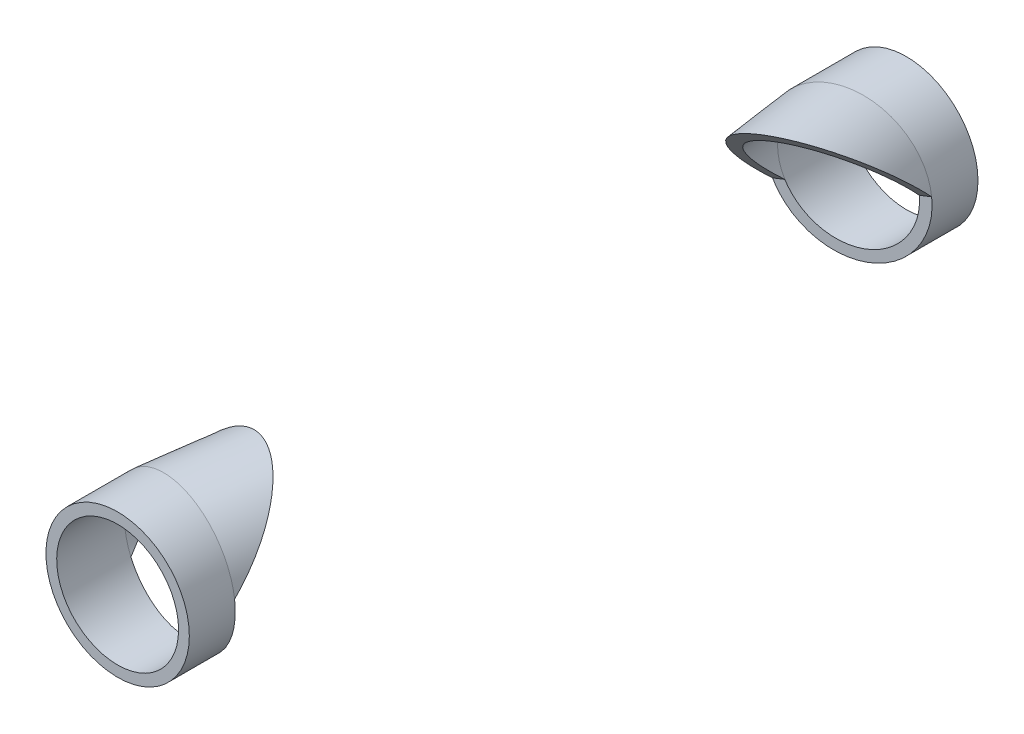
ISO-10303-21;
HEADER;
FILE_DESCRIPTION(('STEP AP214'),'2;1');
FILE_NAME('part.step','',(''),(''),'','','');
FILE_SCHEMA(('AUTOMOTIVE_DESIGN { 1 0 10303 214 1 1 1 1 }'));
ENDSEC;
DATA;
#1=APPLICATION_CONTEXT('core data for automotive mechanical design processes');
#2=APPLICATION_PROTOCOL_DEFINITION('international standard','automotive_design',2000,#1);
#3=PRODUCT_CONTEXT('',#1,'mechanical');
#4=PRODUCT('Part','Part','',(#3));
#5=PRODUCT_RELATED_PRODUCT_CATEGORY('part','',(#4));
#6=PRODUCT_DEFINITION_FORMATION('','',#4);
#7=PRODUCT_DEFINITION_CONTEXT('part definition',#1,'design');
#8=PRODUCT_DEFINITION('design','',#6,#7);
#9=PRODUCT_DEFINITION_SHAPE('','',#8);
#10=(LENGTH_UNIT() NAMED_UNIT(*) SI_UNIT(.MILLI.,.METRE.));
#11=(NAMED_UNIT(*) PLANE_ANGLE_UNIT() SI_UNIT($,.RADIAN.));
#12=(NAMED_UNIT(*) SI_UNIT($,.STERADIAN.) SOLID_ANGLE_UNIT());
#13=UNCERTAINTY_MEASURE_WITH_UNIT(LENGTH_MEASURE(1.E-05),#10,'distance_accuracy_value','');
#14=(GEOMETRIC_REPRESENTATION_CONTEXT(3) GLOBAL_UNCERTAINTY_ASSIGNED_CONTEXT((#13)) GLOBAL_UNIT_ASSIGNED_CONTEXT((#10,
#11,#12)) REPRESENTATION_CONTEXT('',''));
#15=CARTESIAN_POINT('',(0.,0.,0.));
#16=DIRECTION('',(0.,0.,1.));
#17=DIRECTION('',(1.,0.,0.));
#18=AXIS2_PLACEMENT_3D('',#15,#16,#17);
#19=CARTESIAN_POINT('',(159.020263581372,24.1294285061991,-220.702273573353));
#20=DIRECTION('',(-0.16261150339795,-0.0243941865043981,-0.986388575880442));
#21=DIRECTION('',(0.,-0.999694333772214,0.0247232486483956));
#22=AXIS2_PLACEMENT_3D('',#19,#20,#21);
#23=PLANE('',#22);
#24=DIRECTION('',(-0.946649738355044,-0.27803952145627,0.162936482657183));
#25=VECTOR('',#24,1.);
#26=CARTESIAN_POINT('',(0.910270861354675,-3.14163625511007,-193.962548779948));
#27=LINE('',#26,#25);
#28=CARTESIAN_POINT('',(-15.0845281279932,-7.83945222294123,-191.209538682822));
#29=VERTEX_POINT('',#28);
#30=CARTESIAN_POINT('',(-18.0093362344554,-8.69849460506376,-190.706123400479));
#31=VERTEX_POINT('',#30);
#32=EDGE_CURVE('E77',#29,#31,#27,.T.);
#33=ORIENTED_EDGE('',*,*,#32,.T.);
#34=CARTESIAN_POINT('',(0.,0.,-193.890180897479));
#35=DIRECTION('',(-0.16261150339795,-0.0243941865043981,-0.986388575880442));
#36=DIRECTION('',(0.975473354913011,0.146335766243945,-0.164431071797738));
#37=AXIS2_PLACEMENT_3D('',#34,#35,#36);
#38=ELLIPSE('',#37,20.2759850317084,20.);
#39=CARTESIAN_POINT('',(19.8528113921094,2.42195785044465,-197.222921441156));
#40=VERTEX_POINT('',#39);
#41=EDGE_CURVE('E81',#40,#31,#38,.T.);
#42=ORIENTED_EDGE('',*,*,#41,.F.);
#43=CARTESIAN_POINT('',(16.9280032856473,1.56291546832214,-196.719506158813));
#44=VERTEX_POINT('',#43);
#45=EDGE_CURVE('E85',#40,#44,#27,.T.);
#46=ORIENTED_EDGE('',*,*,#45,.T.);
#47=CARTESIAN_POINT('',(0.,0.,-193.890180897479));
#48=DIRECTION('',(-0.16261150339795,-0.0243941865043981,-0.986388575880442));
#49=DIRECTION('',(0.975473354913011,0.146335766243945,-0.164431071797738));
#50=AXIS2_PLACEMENT_3D('',#47,#48,#49);
#51=ELLIPSE('',#50,17.2345872769521,17.);
#52=EDGE_CURVE('E91',#44,#29,#51,.T.);
#53=ORIENTED_EDGE('',*,*,#52,.T.);
#54=EDGE_LOOP('',(#33,#42,#46,#53));
#55=FACE_BOUND('',#54,.T.);
#56=ADVANCED_FACE('F45',(#55),#23,.F.);
#57=CARTESIAN_POINT('',(0.,0.,-210.));
#58=DIRECTION('',(0.,0.,-1.));
#59=DIRECTION('',(1.,0.,0.));
#60=AXIS2_PLACEMENT_3D('',#57,#58,#59);
#61=PLANE('',#60);
#62=CARTESIAN_POINT('',(0.,0.,-210.));
#63=DIRECTION('',(0.,0.,-1.));
#64=DIRECTION('',(1.,0.,0.));
#65=AXIS2_PLACEMENT_3D('',#62,#63,#64);
#66=CIRCLE('',#65,20.);
#67=CARTESIAN_POINT('',(20.,0.,-210.));
#68=VERTEX_POINT('',#67);
#69=EDGE_CURVE('E12',#68,#68,#66,.T.);
#70=ORIENTED_EDGE('',*,*,#69,.T.);
#71=EDGE_LOOP('',(#70));
#72=FACE_BOUND('',#71,.T.);
#73=CARTESIAN_POINT('',(0.,0.,-210.));
#74=DIRECTION('',(0.,0.,-1.));
#75=DIRECTION('',(1.,0.,0.));
#76=AXIS2_PLACEMENT_3D('',#73,#74,#75);
#77=CIRCLE('',#76,17.);
#78=CARTESIAN_POINT('',(17.,0.,-210.));
#79=VERTEX_POINT('',#78);
#80=EDGE_CURVE('E53',#79,#79,#77,.T.);
#81=ORIENTED_EDGE('',*,*,#80,.F.);
#82=EDGE_LOOP('',(#81));
#83=FACE_BOUND('',#82,.T.);
#84=ADVANCED_FACE('F106',(#72,#83),#61,.T.);
#85=CARTESIAN_POINT('',(0.,0.,-210.));
#86=DIRECTION('',(0.,0.,1.));
#87=DIRECTION('',(-1.,0.,0.));
#88=AXIS2_PLACEMENT_3D('',#85,#86,#87);
#89=CYLINDRICAL_SURFACE('',#88,20.);
#90=ORIENTED_EDGE('',*,*,#69,.F.);
#91=EDGE_LOOP('',(#90));
#92=FACE_BOUND('',#91,.T.);
#93=ORIENTED_EDGE('',*,*,#41,.T.);
#94=EDGE_CURVE('E75',#31,#40,#38,.T.);
#95=ORIENTED_EDGE('',*,*,#94,.T.);
#96=EDGE_LOOP('',(#93,#95));
#97=FACE_BOUND('',#96,.T.);
#98=ADVANCED_FACE('F47',(#92,#97),#89,.T.);
#99=CARTESIAN_POINT('',(0.,0.,-210.));
#100=DIRECTION('',(0.,0.,1.));
#101=DIRECTION('',(-1.,0.,0.));
#102=AXIS2_PLACEMENT_3D('',#99,#100,#101);
#103=CYLINDRICAL_SURFACE('',#102,17.);
#104=ORIENTED_EDGE('',*,*,#80,.T.);
#105=EDGE_LOOP('',(#104));
#106=FACE_BOUND('',#105,.T.);
#107=ORIENTED_EDGE('',*,*,#52,.F.);
#108=EDGE_CURVE('E90',#29,#44,#51,.T.);
#109=ORIENTED_EDGE('',*,*,#108,.F.);
#110=EDGE_LOOP('',(#107,#109));
#111=FACE_BOUND('',#110,.T.);
#112=ADVANCED_FACE('F103',(#106,#111),#103,.F.);
#113=CARTESIAN_POINT('',(11.6426036892652,1.7465667548604,-123.267063635657));
#114=DIRECTION('',(0.16261150339795,0.0243941865043981,0.986388575880442));
#115=DIRECTION('',(0.97547335491301,0.146335766243947,-0.164431071797738));
#116=AXIS2_PLACEMENT_3D('',#113,#114,#115);
#117=ELLIPSE('',#116,17.2345872769521,17.);
#118=DIRECTION('',(-0.16261150339795,-0.0243941865043981,-0.986388575880442));
#119=VECTOR('',#118,1.);
#120=SURFACE_OF_LINEAR_EXTRUSION('',#117,#119);
#121=CARTESIAN_POINT('',(-15.0845281279933,-7.83945222294125,-191.209538682822));
#122=CARTESIAN_POINT('',(-15.1612871559029,-7.60982072736148,-190.956322702624));
#123=CARTESIAN_POINT('',(-15.232746514392,-7.37805778490534,-190.703471758801));
#124=CARTESIAN_POINT('',(-15.3650949812381,-6.91052197809102,-190.198727567382));
#125=CARTESIAN_POINT('',(-15.4259844312446,-6.6747492436113,-189.946834289088));
#126=CARTESIAN_POINT('',(-15.592835515124,-5.96182868254459,-189.192966400034));
#127=CARTESIAN_POINT('',(-15.6829977560138,-5.47902487003654,-188.692744622895));
#128=CARTESIAN_POINT('',(-15.8210783631236,-4.50060333773084,-187.699185164218));
#129=CARTESIAN_POINT('',(-15.868999204065,-4.00498637034588,-187.205847081063));
#130=CARTESIAN_POINT('',(-15.922254119359,-3.0028190814749,-186.227999660757));
#131=CARTESIAN_POINT('',(-15.927587197789,-2.49626850458216,-185.743490530337));
#132=CARTESIAN_POINT('',(-15.8949860998728,-1.47409772179016,-184.785382125877));
#133=CARTESIAN_POINT('',(-15.8570428829237,-0.958475642974025,-184.311785152522));
#134=CARTESIAN_POINT('',(-15.7368875187638,0.0796918860778796,-183.377996132474));
#135=CARTESIAN_POINT('',(-15.6546780266053,0.602236919247628,-182.917803283559));
#136=CARTESIAN_POINT('',(-15.4446273352371,1.65232854250528,-182.013267064877));
#137=CARTESIAN_POINT('',(-15.3167659946653,2.17987724001986,-181.568930786277));
#138=CARTESIAN_POINT('',(-15.0137435513342,3.23736060342348,-180.699350427098));
#139=CARTESIAN_POINT('',(-14.8385751180095,3.76729562656551,-180.27410931737));
#140=CARTESIAN_POINT('',(-14.4399606658589,4.82397599651774,-179.448467451121));
#141=CARTESIAN_POINT('',(-14.2167522642605,5.35072437312303,-179.047956490908));
#142=CARTESIAN_POINT('',(-13.7195027496257,6.39982821453472,-178.274074107531));
#143=CARTESIAN_POINT('',(-13.4454914610039,6.92218606973304,-177.900686939117));
#144=CARTESIAN_POINT('',(-12.8929395495552,7.87450959023015,-177.24389089397));
#145=CARTESIAN_POINT('',(-12.6222965247528,8.305756495543,-176.955695659321));
#146=CARTESIAN_POINT('',(-12.0418973119752,9.159672940856,-176.405134056145));
#147=CARTESIAN_POINT('',(-11.732085631783,9.58232930423376,-176.142805291366));
#148=CARTESIAN_POINT('',(-11.1153005476024,10.3605504738459,-175.68071903837));
#149=CARTESIAN_POINT('',(-10.8131395706409,10.7177241336275,-175.477256813521));
#150=CARTESIAN_POINT('',(-10.1781564578294,11.4189452839543,-175.096673113593));
#151=CARTESIAN_POINT('',(-9.84532507882441,11.7629887729864,-174.919559621567));
#152=CARTESIAN_POINT('',(-9.14938788479223,12.4338723000489,-174.595379203276));
#153=CARTESIAN_POINT('',(-8.78630659824536,12.7607259324973,-174.448288260448));
#154=CARTESIAN_POINT('',(-8.2197746562536,13.2348395614639,-174.25293401351));
#155=CARTESIAN_POINT('',(-8.02730497183945,13.3901641730573,-174.192035786239));
#156=CARTESIAN_POINT('',(-7.635158391571,13.6949437167719,-174.079080840661));
#157=CARTESIAN_POINT('',(-7.43547973360226,13.8443971948935,-174.027026302033));
#158=CARTESIAN_POINT('',(-6.93536458773089,14.2043341985136,-173.910340378622));
#159=CARTESIAN_POINT('',(-6.63099133829881,14.4111199666548,-173.851006311768));
#160=CARTESIAN_POINT('',(-6.00878749966731,14.8087090317113,-173.753627234234));
#161=CARTESIAN_POINT('',(-5.69096005941402,14.9995160376504,-173.715577271331));
#162=CARTESIAN_POINT('',(-5.04358489445133,15.3631143379302,-173.661916958458));
#163=CARTESIAN_POINT('',(-4.71404560018038,15.5359182526138,-173.646290789684));
#164=CARTESIAN_POINT('',(-4.04503877552471,15.861790088766,-173.638305931259));
#165=CARTESIAN_POINT('',(-3.70557101619056,16.0148575546731,-173.645947778586));
#166=CARTESIAN_POINT('',(-3.01771078875665,16.3001639723234,-173.685085495143));
#167=CARTESIAN_POINT('',(-2.66928794146475,16.4323167632501,-173.716677087189));
#168=CARTESIAN_POINT('',(-1.96753615035512,16.6736952750359,-173.803896544597));
#169=CARTESIAN_POINT('',(-1.61420721510919,16.7829210359472,-173.85952436797));
#170=CARTESIAN_POINT('',(-0.905498153477816,16.9775176641538,-173.994409905649));
#171=CARTESIAN_POINT('',(-0.550118005519053,17.0628882800879,-174.073667868928));
#172=CARTESIAN_POINT('',(0.159824285620206,17.2093191323935,-174.254951310848));
#173=CARTESIAN_POINT('',(0.51438644622412,17.2703798914166,-174.356976299933));
#174=CARTESIAN_POINT('',(1.19974580243548,17.3654196533928,-174.576067376226));
#175=CARTESIAN_POINT('',(1.53074084850884,17.4007496649581,-174.691937024612));
#176=CARTESIAN_POINT('',(2.18751352856145,17.4502197644824,-174.9414870005));
#177=CARTESIAN_POINT('',(2.51329149933997,17.4643612258128,-175.075166173035));
#178=CARTESIAN_POINT('',(3.15798699603002,17.4721277431897,-175.358952110279));
#179=CARTESIAN_POINT('',(3.47690180008594,17.4657448051186,-175.509065253915));
#180=CARTESIAN_POINT('',(4.10629198212578,17.4333385769174,-175.824172216427));
#181=CARTESIAN_POINT('',(4.4167657358072,17.4073115340207,-175.989168873313));
#182=CARTESIAN_POINT('',(5.13054742873233,17.3247914602107,-176.390086329226));
#183=CARTESIAN_POINT('',(5.53009159294359,17.2610109129039,-176.631242977437));
#184=CARTESIAN_POINT('',(6.30991526959753,17.1029383600173,-177.133894102092));
#185=CARTESIAN_POINT('',(6.69018835721479,17.008636255188,-177.395395288535));
#186=CARTESIAN_POINT('',(7.4303318011825,16.7922020585684,-177.935669432241));
#187=CARTESIAN_POINT('',(7.79018780110574,16.6700506799525,-178.214454261295));
#188=CARTESIAN_POINT('',(8.48836779710209,16.4006568036998,-178.786178984248));
#189=CARTESIAN_POINT('',(8.8266963287434,16.2534196155311,-179.079115873451));
#190=CARTESIAN_POINT('',(9.58884807068831,15.8843786040723,-179.774570896888));
#191=CARTESIAN_POINT('',(10.0044153420226,15.6539411143142,-180.181577162692));
#192=CARTESIAN_POINT('',(10.7967427494077,15.1586895391893,-181.010779709015));
#193=CARTESIAN_POINT('',(11.1735461976943,14.8939145851528,-181.43295830902));
#194=CARTESIAN_POINT('',(11.8891454060059,14.334476728832,-182.288594605332));
#195=CARTESIAN_POINT('',(12.227975968502,14.0398416732005,-182.722041517669));
#196=CARTESIAN_POINT('',(12.8688661915242,13.4241952805671,-183.597430868772));
#197=CARTESIAN_POINT('',(13.1709157783734,13.1031767577283,-184.03937559674));
#198=CARTESIAN_POINT('',(13.7387116702788,12.4383556863261,-184.928552915414));
#199=CARTESIAN_POINT('',(14.0044900638168,12.0945736814576,-185.375780446832));
#200=CARTESIAN_POINT('',(14.500817387675,11.3867550409157,-186.27360105769));
#201=CARTESIAN_POINT('',(14.7313690634157,11.0227199866984,-186.724193871979));
#202=CARTESIAN_POINT('',(15.1578627373145,10.2768705823322,-187.626669119958));
#203=CARTESIAN_POINT('',(15.3538194791603,9.89506389420254,-188.078550920465));
#204=CARTESIAN_POINT('',(15.7117536971459,9.11566295668559,-188.981993269444));
#205=CARTESIAN_POINT('',(15.8737301423106,8.71806822871834,-189.433553807755));
#206=CARTESIAN_POINT('',(16.3092525830642,7.5043529942296,-190.785389833928));
#207=CARTESIAN_POINT('',(16.5326708895887,6.66680645451487,-191.683416927475));
#208=CARTESIAN_POINT('',(16.7515473075699,5.46766564409457,-192.92353354142));
#209=CARTESIAN_POINT('',(16.8032102593787,5.12384621370988,-193.274091167035));
#210=CARTESIAN_POINT('',(16.8855371106341,4.43003067678881,-193.971600709148));
#211=CARTESIAN_POINT('',(16.9162027996414,4.08003509924356,-194.318552930446));
#212=CARTESIAN_POINT('',(16.9565626783665,3.37168246685857,-195.010943453661));
#213=CARTESIAN_POINT('',(16.9660814689282,3.01328021569242,-195.35634555111));
#214=CARTESIAN_POINT('',(16.9633964195216,2.29158516047595,-196.041993187062));
#215=CARTESIAN_POINT('',(16.9511902064843,1.92829182646406,-196.382238158147));
#216=CARTESIAN_POINT('',(16.9280032856471,1.56291546832212,-196.719506158813));
#217=B_SPLINE_CURVE_WITH_KNOTS('',3,(#121,#122,#123,#124,#125,#126,#127,#128,#129,#130,#131,
#132,#133,#134,#135,#136,#137,#138,#139,#140,#141,#142,#143,#144,#145,#146,#147,#148,#149,#150,
#151,#152,#153,#154,#155,#156,#157,#158,#159,#160,#161,#162,#163,#164,#165,#166,#167,#168,#169,
#170,#171,#172,#173,#174,#175,#176,#177,#178,#179,#180,#181,#182,#183,#184,#185,#186,#187,#188,
#189,#190,#191,#192,#193,#194,#195,#196,#197,#198,#199,#200,#201,#202,#203,#204,#205,#206,#207,
#208,#209,#210,#211,#212,#213,#214,#215,#216),.UNSPECIFIED.,.F.,.F.,(4,2,2,2,2,2,2,2,2,2,2,2,2,
2,2,2,2,2,2,2,2,2,2,2,2,2,2,2,2,2,2,2,2,2,2,2,2,2,2,2,2,2,2,2,2,2,2,4),(0.,1.05093126493316,
2.10182855444848,4.20337822235659,6.30480476234851,8.40628044444371,10.5081952142103,
12.6099839270158,14.7127010864378,16.8157442637531,18.9086150125485,21.0002609858475,
22.7536729473739,24.50959749412,26.0384847992218,27.5678343822503,29.0959557240447,
29.8598214161952,30.6238751039285,31.7408590360559,32.8575829686848,33.9735187235484,
35.0894802321028,36.2099257081804,37.3303692268902,38.4508245512514,39.5712557849973,
40.6275028117566,41.683681373128,42.7402713588771,43.7970632443677,45.208066666486,
46.6195374523415,48.0319887280771,49.4441414258479,51.3184377468357,53.190616567806,
55.0610652410004,56.9320250511872,58.8013187752334,60.6704667400935,62.5388161772904,
64.4072222927186,68.1415757917394,69.6224750652952,71.1032481086359,72.5962580130949,
74.0894310122615),.UNSPECIFIED.);
#218=EDGE_CURVE('E67',#29,#44,#217,.T.);
#219=ORIENTED_EDGE('',*,*,#218,.F.);
#220=ORIENTED_EDGE('',*,*,#108,.T.);
#221=EDGE_LOOP('',(#219,#220));
#222=FACE_BOUND('',#221,.T.);
#223=ADVANCED_FACE('F117',(#222),#120,.T.);
#224=CARTESIAN_POINT('',(11.6426036892652,1.7465667548604,-123.267063635657));
#225=DIRECTION('',(0.16261150339795,0.0243941865043981,0.986388575880442));
#226=DIRECTION('',(0.97547335491301,0.146335766243949,-0.164431071797738));
#227=AXIS2_PLACEMENT_3D('',#224,#225,#226);
#228=ELLIPSE('',#227,20.2759850317084,20.);
#229=DIRECTION('',(-0.16261150339795,-0.0243941865043981,-0.986388575880442));
#230=VECTOR('',#229,1.);
#231=SURFACE_OF_LINEAR_EXTRUSION('',#228,#230);
#232=CARTESIAN_POINT('',(-18.0093362344556,-8.6984946050638,-190.706123400479));
#233=CARTESIAN_POINT('',(-18.0914126977776,-8.42508600412158,-190.408841717572));
#234=CARTESIAN_POINT('',(-18.1672708315402,-8.1492829563104,-190.112089679586));
#235=CARTESIAN_POINT('',(-18.306570293442,-7.59317418992524,-189.519908334189));
#236=CARTESIAN_POINT('',(-18.3700119641423,-7.31286859580419,-189.224478990505));
#237=CARTESIAN_POINT('',(-18.5417405274645,-6.46564299976824,-188.340585769938));
#238=CARTESIAN_POINT('',(-18.6314421643314,-5.89237680219161,-187.754476070557));
#239=CARTESIAN_POINT('',(-18.7610489110115,-4.73152751430538,-186.591121493443));
#240=CARTESIAN_POINT('',(-18.8009557512912,-4.14394492224204,-186.013876308339));
#241=CARTESIAN_POINT('',(-18.8304437980178,-2.95668178662346,-184.870601569143));
#242=CARTESIAN_POINT('',(-18.8200248362866,-2.35700120264598,-184.304572052538));
#243=CARTESIAN_POINT('',(-18.7479357658123,-1.14770244466511,-183.18620274493));
#244=CARTESIAN_POINT('',(-18.6862520065336,-0.538081666227573,-182.633866640487));
#245=CARTESIAN_POINT('',(-18.5103294531923,0.688481179263036,-181.54596307786));
#246=CARTESIAN_POINT('',(-18.3960942834567,1.30542273856376,-181.010394465989));
#247=CARTESIAN_POINT('',(-18.113310961874,2.54435657780216,-179.958980840166));
#248=CARTESIAN_POINT('',(-17.9447317958212,3.16635154366011,-179.443147277545));
#249=CARTESIAN_POINT('',(-17.551203732757,4.41200928488282,-178.435352308658));
#250=CARTESIAN_POINT('',(-17.3262533028267,5.03567210514565,-177.943391552005));
#251=CARTESIAN_POINT('',(-16.825496943313,6.2615888690173,-177.002814507844));
#252=CARTESIAN_POINT('',(-16.5514904024456,6.86390535991193,-176.553325995763));
#253=CARTESIAN_POINT('',(-15.945891181311,8.06249728991104,-175.686107291111));
#254=CARTESIAN_POINT('',(-15.6143086922696,8.65877377839075,-175.268371496935));
#255=CARTESIAN_POINT('',(-14.9489065476288,9.74572787637671,-174.534412169464));
#256=CARTESIAN_POINT('',(-14.6239094081069,10.2380554420419,-174.212633618793));
#257=CARTESIAN_POINT('',(-13.9301536755605,11.2110638127268,-173.59992603213));
#258=CARTESIAN_POINT('',(-13.5614006609852,11.6917460930183,-173.308993072562));
#259=CARTESIAN_POINT('',(-12.8342384981728,12.5702709166173,-172.801296568279));
#260=CARTESIAN_POINT('',(-12.4816780406918,12.9702509116543,-172.579857173185));
#261=CARTESIAN_POINT('',(-11.7433836584535,13.7545434715212,-172.166872419813));
#262=CARTESIAN_POINT('',(-11.3576649951123,14.138863125398,-171.975313421823));
#263=CARTESIAN_POINT('',(-10.6036770340226,14.8409643122262,-171.647640861384));
#264=CARTESIAN_POINT('',(-10.2392686478515,15.1610524108527,-171.507588280505));
#265=CARTESIAN_POINT('',(-9.48556395196988,15.7834588859927,-171.255635797348));
#266=CARTESIAN_POINT('',(-9.09624342902343,16.0857594090387,-171.143763822728));
#267=CARTESIAN_POINT('',(-8.32919246949368,16.6435603309999,-170.9593263754));
#268=CARTESIAN_POINT('',(-7.95337912765778,16.9008463937875,-170.884195570686));
#269=CARTESIAN_POINT('',(-7.18391329461154,17.39482778599,-170.761587898542));
#270=CARTESIAN_POINT('',(-6.79025633389335,17.6315179126574,-170.714118001393));
#271=CARTESIAN_POINT('',(-5.98727339833533,18.0815748329746,-170.648452702667));
#272=CARTESIAN_POINT('',(-5.57794293488206,18.2949348768242,-170.630265752379));
#273=CARTESIAN_POINT('',(-4.74654583796205,18.6956606735071,-170.624383760855));
#274=CARTESIAN_POINT('',(-4.32448062912198,18.8830293209486,-170.636685321292));
#275=CARTESIAN_POINT('',(-3.48434912143232,19.2240871716906,-170.691536136844));
#276=CARTESIAN_POINT('',(-3.06657502242091,19.3786507517038,-170.733121247137));
#277=CARTESIAN_POINT('',(-2.22553307004792,19.6597000438344,-170.845495337055));
#278=CARTESIAN_POINT('',(-1.8022652210585,19.7861857782959,-170.916284293439));
#279=CARTESIAN_POINT('',(-0.95392902220078,20.009975723801,-171.086448397056));
#280=CARTESIAN_POINT('',(-0.528861298030127,20.1072893469545,-171.185814303885));
#281=CARTESIAN_POINT('',(0.319687287675332,20.2723290343489,-171.411988838152));
#282=CARTESIAN_POINT('',(0.743168195736907,20.3400559729336,-171.538796654462));
#283=CARTESIAN_POINT('',(1.55494098650956,20.4422554345733,-171.808168411186));
#284=CARTESIAN_POINT('',(1.943574119211,20.4787684712115,-171.948944455359));
#285=CARTESIAN_POINT('',(2.71423665624357,20.5269648247242,-172.251145202022));
#286=CARTESIAN_POINT('',(3.09626657564217,20.5386500869768,-172.412568285664));
#287=CARTESIAN_POINT('',(3.85186365208333,20.538042395987,-172.754413072153));
#288=CARTESIAN_POINT('',(4.22542732667709,20.5257397505223,-172.934842426545));
#289=CARTESIAN_POINT('',(4.96229885852962,20.478232250068,-173.312865849449));
#290=CARTESIAN_POINT('',(5.32560471943408,20.4430229686584,-173.510463229071));
#291=CARTESIAN_POINT('',(6.1656744501094,20.3348253046889,-173.9928570322));
#292=CARTESIAN_POINT('',(6.63768272653837,20.2529310218233,-174.283981616726));
#293=CARTESIAN_POINT('',(7.55818778390879,20.052952280045,-174.89005513931));
#294=CARTESIAN_POINT('',(8.00667649505089,19.9348554936047,-175.205012165135));
#295=CARTESIAN_POINT('',(8.87889665706202,19.6657223368224,-175.855094226136));
#296=CARTESIAN_POINT('',(9.30260976514822,19.5146619435682,-176.190233840147));
#297=CARTESIAN_POINT('',(10.1240056306982,19.1829099369844,-176.876957408552));
#298=CARTESIAN_POINT('',(10.5216939234507,19.0022246535005,-177.22853783865));
#299=CARTESIAN_POINT('',(11.4178079770292,18.5501076783343,-178.063563179266));
#300=CARTESIAN_POINT('',(11.9061906090425,18.2684024658349,-178.552249736682));
#301=CARTESIAN_POINT('',(12.8361305393571,17.6643905432176,-179.547115875204));
#302=CARTESIAN_POINT('',(13.2777406989721,17.3421305887973,-180.053274832295));
#303=CARTESIAN_POINT('',(14.1151839210673,16.6623550585854,-181.078471365649));
#304=CARTESIAN_POINT('',(14.5110585733738,16.3048720700887,-181.597496711639));
#305=CARTESIAN_POINT('',(15.2585478903115,15.5588166868304,-182.645146106697));
#306=CARTESIAN_POINT('',(15.6101500702579,15.1702355728059,-183.173772815444));
#307=CARTESIAN_POINT('',(16.2696880153103,14.3662543101469,-184.236828774247));
#308=CARTESIAN_POINT('',(16.5776616606627,13.9508778881999,-184.771252551516));
#309=CARTESIAN_POINT('',(17.1512104367658,13.0963065988365,-185.843619539229));
#310=CARTESIAN_POINT('',(17.416789747842,12.6571140855528,-186.381562397219));
#311=CARTESIAN_POINT('',(17.906273570856,11.7578746982732,-187.458473398849));
#312=CARTESIAN_POINT('',(18.1301964669282,11.297837135785,-187.997440983648));
#313=CARTESIAN_POINT('',(18.5371463160348,10.3591274445839,-189.074640560652));
#314=CARTESIAN_POINT('',(18.7201689474261,9.88045335294879,-189.612872469156));
#315=CARTESIAN_POINT('',(19.0641247074185,8.85157653011733,-190.747435634276));
#316=CARTESIAN_POINT('',(19.2202192388793,8.2994064129595,-191.343453956388));
#317=CARTESIAN_POINT('',(19.4824620704874,7.17749068946812,-192.529659475634));
#318=CARTESIAN_POINT('',(19.588618254737,6.60774787259927,-193.11984757881));
#319=CARTESIAN_POINT('',(19.7521662791646,5.44432767716411,-194.300978594504));
#320=CARTESIAN_POINT('',(19.8088036212347,4.85041958470697,-194.891800314758));
#321=CARTESIAN_POINT('',(19.8548557198691,3.94845442897773,-195.771028987873));
#322=CARTESIAN_POINT('',(19.8636992337057,3.64528422258165,-196.063559986372));
#323=CARTESIAN_POINT('',(19.8681847282916,3.03585771496156,-196.645596628816));
#324=CARTESIAN_POINT('',(19.8638244357224,2.72960089135782,-196.93510174318));
#325=CARTESIAN_POINT('',(19.8528113921094,2.42195785044464,-197.222921441156));
#326=B_SPLINE_CURVE_WITH_KNOTS('',3,(#232,#233,#234,#235,#236,#237,#238,#239,#240,#241,#242,
#243,#244,#245,#246,#247,#248,#249,#250,#251,#252,#253,#254,#255,#256,#257,#258,#259,#260,#261,
#262,#263,#264,#265,#266,#267,#268,#269,#270,#271,#272,#273,#274,#275,#276,#277,#278,#279,#280,
#281,#282,#283,#284,#285,#286,#287,#288,#289,#290,#291,#292,#293,#294,#295,#296,#297,#298,#299,
#300,#301,#302,#303,#304,#305,#306,#307,#308,#309,#310,#311,#312,#313,#314,#315,#316,#317,#318,
#319,#320,#321,#322,#323,#324,#325),.UNSPECIFIED.,.F.,.F.,(4,2,2,2,2,2,2,2,2,2,2,2,2,2,2,2,2,2,
2,2,2,2,2,2,2,2,2,2,2,2,2,2,2,2,2,2,2,2,2,2,2,2,2,2,2,2,4),(0.,1.23632487929271,
2.47261564446971,4.94502848138211,7.41735539471766,9.88969057004801,12.3626842775037,
14.8355074549132,17.3097443823259,19.7840485996226,22.1813940052684,24.5783155007561,
26.592259599136,28.6059472145071,30.336221542641,32.0657037143657,33.5786674672308,
35.0931247563823,36.4764012018061,37.8600260689261,39.2440501895799,40.6279200503682,
41.9682365429206,43.3085519688567,44.6484344879295,45.9882774081985,47.2318059645524,
48.4752370807418,49.7191707046259,50.9633447745,52.6426344050289,54.3224964967345,
56.0035869358638,57.6843186493137,59.919465609672,62.1520588726294,64.3826056631321,
66.6137800581247,68.8430052161838,71.0720104238298,73.3000295635728,75.5282840112294,
78.0085231595679,80.4883706043617,83.0053750789527,84.2693306837628,85.5335039180141),.UNSPECIFIED.);
#327=EDGE_CURVE('E60',#31,#40,#326,.T.);
#328=ORIENTED_EDGE('',*,*,#327,.T.);
#329=ORIENTED_EDGE('',*,*,#94,.F.);
#330=EDGE_LOOP('',(#328,#329));
#331=FACE_BOUND('',#330,.T.);
#332=ADVANCED_FACE('F74',(#331),#231,.F.);
#333=CARTESIAN_POINT('',(151.969388338791,57.82974309489,-204.160182485789));
#334=DIRECTION('',(-0.310945598507739,0.65523310047211,-0.688463810824047));
#335=DIRECTION('',(0.,-0.724372619296341,-0.689408665751859));
#336=AXIS2_PLACEMENT_3D('',#333,#334,#335);
#337=PLANE('',#336);
#338=ORIENTED_EDGE('',*,*,#32,.F.);
#339=ORIENTED_EDGE('',*,*,#218,.T.);
#340=ORIENTED_EDGE('',*,*,#45,.F.);
#341=ORIENTED_EDGE('',*,*,#327,.F.);
#342=EDGE_LOOP('',(#338,#339,#340,#341));
#343=FACE_BOUND('',#342,.T.);
#344=ADVANCED_FACE('F86',(#343),#337,.F.);
#345=CLOSED_SHELL('',(#56,#84,#98,#112,#223,#332,#344));
#346=MANIFOLD_SOLID_BREP('B2_NOT_SHOWN',#345);
#347=CARTESIAN_POINT('',(159.020263581372,24.1294285061991,20.7022735733532));
#348=DIRECTION('',(-0.16261150339795,-0.0243941865043981,0.986388575880442));
#349=DIRECTION('',(0.,-0.999694333772214,-0.0247232486483956));
#350=AXIS2_PLACEMENT_3D('',#347,#348,#349);
#351=PLANE('',#350);
#352=DIRECTION('',(-0.946649738355044,-0.27803952145627,-0.162936482657183));
#353=VECTOR('',#352,1.);
#354=CARTESIAN_POINT('',(0.910270861354675,-3.14163625511007,-6.0374512200519));
#355=LINE('',#354,#353);
#356=CARTESIAN_POINT('',(-15.0845281279932,-7.83945222294123,-8.79046131717778));
#357=VERTEX_POINT('',#356);
#358=CARTESIAN_POINT('',(-18.0093362344554,-8.69849460506376,-9.29387659952104));
#359=VERTEX_POINT('',#358);
#360=EDGE_CURVE('E218',#357,#359,#355,.T.);
#361=ORIENTED_EDGE('',*,*,#360,.F.);
#362=CARTESIAN_POINT('',(0.,0.,-6.1098191025209));
#363=DIRECTION('',(0.16261150339795,0.0243941865043981,-0.986388575880442));
#364=DIRECTION('',(0.975473354913011,0.146335766243945,0.164431071797738));
#365=AXIS2_PLACEMENT_3D('',#362,#363,#364);
#366=ELLIPSE('',#365,17.2345872769521,17.);
#367=CARTESIAN_POINT('',(16.9280032856473,1.56291546832214,-3.28049384118733));
#368=VERTEX_POINT('',#367);
#369=EDGE_CURVE('E230',#368,#357,#366,.T.);
#370=ORIENTED_EDGE('',*,*,#369,.F.);
#371=CARTESIAN_POINT('',(19.8528113921094,2.42195785044465,-2.77707855884409));
#372=VERTEX_POINT('',#371);
#373=EDGE_CURVE('E215',#372,#368,#355,.T.);
#374=ORIENTED_EDGE('',*,*,#373,.F.);
#375=CARTESIAN_POINT('',(0.,0.,-6.1098191025209));
#376=DIRECTION('',(0.16261150339795,0.0243941865043981,-0.986388575880442));
#377=DIRECTION('',(0.975473354913011,0.146335766243945,0.164431071797738));
#378=AXIS2_PLACEMENT_3D('',#375,#376,#377);
#379=ELLIPSE('',#378,20.2759850317084,20.);
#380=EDGE_CURVE('E225',#372,#359,#379,.T.);
#381=ORIENTED_EDGE('',*,*,#380,.T.);
#382=EDGE_LOOP('',(#361,#370,#374,#381));
#383=FACE_BOUND('',#382,.T.);
#384=ADVANCED_FACE('F186',(#383),#351,.F.);
#385=CARTESIAN_POINT('',(0.,0.,10.));
#386=DIRECTION('',(0.,0.,1.));
#387=DIRECTION('',(1.,0.,0.));
#388=AXIS2_PLACEMENT_3D('',#385,#386,#387);
#389=PLANE('',#388);
#390=CARTESIAN_POINT('',(0.,0.,10.));
#391=DIRECTION('',(0.,0.,-1.));
#392=DIRECTION('',(1.,0.,0.));
#393=AXIS2_PLACEMENT_3D('',#390,#391,#392);
#394=CIRCLE('',#393,20.);
#395=CARTESIAN_POINT('',(20.,0.,10.));
#396=VERTEX_POINT('',#395);
#397=EDGE_CURVE('E43',#396,#396,#394,.T.);
#398=ORIENTED_EDGE('',*,*,#397,.F.);
#399=EDGE_LOOP('',(#398));
#400=FACE_BOUND('',#399,.T.);
#401=CARTESIAN_POINT('',(0.,0.,10.));
#402=DIRECTION('',(0.,0.,-1.));
#403=DIRECTION('',(1.,0.,0.));
#404=AXIS2_PLACEMENT_3D('',#401,#402,#403);
#405=CIRCLE('',#404,17.);
#406=CARTESIAN_POINT('',(17.,0.,10.));
#407=VERTEX_POINT('',#406);
#408=EDGE_CURVE('E194',#407,#407,#405,.T.);
#409=ORIENTED_EDGE('',*,*,#408,.T.);
#410=EDGE_LOOP('',(#409));
#411=FACE_BOUND('',#410,.T.);
#412=ADVANCED_FACE('F257',(#400,#411),#389,.T.);
#413=CARTESIAN_POINT('',(0.,0.,10.));
#414=DIRECTION('',(0.,0.,-1.));
#415=DIRECTION('',(-1.,0.,0.));
#416=AXIS2_PLACEMENT_3D('',#413,#414,#415);
#417=CYLINDRICAL_SURFACE('',#416,20.);
#418=ORIENTED_EDGE('',*,*,#397,.T.);
#419=EDGE_LOOP('',(#418));
#420=FACE_BOUND('',#419,.T.);
#421=ORIENTED_EDGE('',*,*,#380,.F.);
#422=EDGE_CURVE('E220',#359,#372,#379,.T.);
#423=ORIENTED_EDGE('',*,*,#422,.F.);
#424=EDGE_LOOP('',(#421,#423));
#425=FACE_BOUND('',#424,.T.);
#426=ADVANCED_FACE('F188',(#420,#425),#417,.T.);
#427=CARTESIAN_POINT('',(0.,0.,10.));
#428=DIRECTION('',(0.,0.,-1.));
#429=DIRECTION('',(-1.,0.,0.));
#430=AXIS2_PLACEMENT_3D('',#427,#428,#429);
#431=CYLINDRICAL_SURFACE('',#430,17.);
#432=ORIENTED_EDGE('',*,*,#408,.F.);
#433=EDGE_LOOP('',(#432));
#434=FACE_BOUND('',#433,.T.);
#435=ORIENTED_EDGE('',*,*,#369,.T.);
#436=EDGE_CURVE('E228',#357,#368,#366,.T.);
#437=ORIENTED_EDGE('',*,*,#436,.T.);
#438=EDGE_LOOP('',(#435,#437));
#439=FACE_BOUND('',#438,.T.);
#440=ADVANCED_FACE('F259',(#434,#439),#431,.F.);
#441=CARTESIAN_POINT('',(11.6426036892652,1.7465667548604,-76.7329363643434));
#442=DIRECTION('',(-0.16261150339795,-0.0243941865043981,0.986388575880442));
#443=DIRECTION('',(0.97547335491301,0.146335766243947,0.164431071797738));
#444=AXIS2_PLACEMENT_3D('',#441,#442,#443);
#445=ELLIPSE('',#444,17.2345872769521,17.);
#446=DIRECTION('',(-0.16261150339795,-0.0243941865043981,0.986388575880442));
#447=VECTOR('',#446,1.);
#448=SURFACE_OF_LINEAR_EXTRUSION('',#445,#447);
#449=CARTESIAN_POINT('',(-15.0845281279933,-7.83945222294125,-8.79046131717781));
#450=CARTESIAN_POINT('',(-15.1612871559029,-7.60982072736149,-9.04367729737629));
#451=CARTESIAN_POINT('',(-15.232746514392,-7.37805778490537,-9.29652824119869));
#452=CARTESIAN_POINT('',(-15.365094981238,-6.91052197809105,-9.80127243261781));
#453=CARTESIAN_POINT('',(-15.4259844312446,-6.67474924361132,-10.0531657109115));
#454=CARTESIAN_POINT('',(-15.592835515124,-5.9618286825446,-10.8070335999664));
#455=CARTESIAN_POINT('',(-15.6829977560138,-5.47902487003654,-11.3072553771045));
#456=CARTESIAN_POINT('',(-15.8210783631236,-4.50060333773085,-12.3008148357821));
#457=CARTESIAN_POINT('',(-15.868999204065,-4.0049863703459,-12.7941529189374));
#458=CARTESIAN_POINT('',(-15.922254119359,-3.00281908147492,-13.7720003392432));
#459=CARTESIAN_POINT('',(-15.927587197789,-2.49626850458216,-14.2565094696627));
#460=CARTESIAN_POINT('',(-15.8949860998728,-1.47409772179016,-15.214617874123));
#461=CARTESIAN_POINT('',(-15.8570428829237,-0.958475642974038,-15.6882148474784));
#462=CARTESIAN_POINT('',(-15.7368875187638,0.0796918860778639,-16.6220038675259));
#463=CARTESIAN_POINT('',(-15.6546780266053,0.602236919247624,-17.0821967164408));
#464=CARTESIAN_POINT('',(-15.4446273352371,1.65232854250529,-17.9867329351231));
#465=CARTESIAN_POINT('',(-15.3167659946653,2.17987724001986,-18.4310692137232));
#466=CARTESIAN_POINT('',(-15.0137435513342,3.23736060342348,-19.3006495729017));
#467=CARTESIAN_POINT('',(-14.8385751180095,3.76729562656551,-19.7258906826296));
#468=CARTESIAN_POINT('',(-14.4399606658589,4.82397599651774,-20.5515325488791));
#469=CARTESIAN_POINT('',(-14.2167522642605,5.35072437312303,-20.9520435090917));
#470=CARTESIAN_POINT('',(-13.7195027496257,6.39982821453472,-21.7259258924691));
#471=CARTESIAN_POINT('',(-13.4454914610039,6.92218606973304,-22.0993130608832));
#472=CARTESIAN_POINT('',(-12.8929395495552,7.87450959023014,-22.7561091060298));
#473=CARTESIAN_POINT('',(-12.6222965247528,8.305756495543,-23.0443043406792));
#474=CARTESIAN_POINT('',(-12.0418973119752,9.15967294085599,-23.5948659438553));
#475=CARTESIAN_POINT('',(-11.732085631783,9.58232930423376,-23.8571947086338));
#476=CARTESIAN_POINT('',(-11.1153005476024,10.3605504738459,-24.3192809616295));
#477=CARTESIAN_POINT('',(-10.8131395706409,10.7177241336275,-24.5227431864791));
#478=CARTESIAN_POINT('',(-10.1781564578294,11.4189452839543,-24.9033268864068));
#479=CARTESIAN_POINT('',(-9.84532507882442,11.7629887729864,-25.0804403784333));
#480=CARTESIAN_POINT('',(-9.14938788479224,12.4338723000489,-25.4046207967236));
#481=CARTESIAN_POINT('',(-8.78630659824537,12.7607259324973,-25.5517117395522));
#482=CARTESIAN_POINT('',(-8.21977465625361,13.2348395614639,-25.74706598649));
#483=CARTESIAN_POINT('',(-8.02730497183945,13.3901641730573,-25.8079642137607));
#484=CARTESIAN_POINT('',(-7.635158391571,13.6949437167719,-25.920919159339));
#485=CARTESIAN_POINT('',(-7.43547973360226,13.8443971948935,-25.9729736979672));
#486=CARTESIAN_POINT('',(-6.93536458773089,14.2043341985136,-26.089659621378));
#487=CARTESIAN_POINT('',(-6.63099133829882,14.4111199666548,-26.1489936882323));
#488=CARTESIAN_POINT('',(-6.00878749966731,14.8087090317113,-26.2463727657665));
#489=CARTESIAN_POINT('',(-5.69096005941402,14.9995160376504,-26.2844227286689));
#490=CARTESIAN_POINT('',(-5.04358489445133,15.3631143379302,-26.3380830415416));
#491=CARTESIAN_POINT('',(-4.71404560018038,15.5359182526138,-26.353709210316));
#492=CARTESIAN_POINT('',(-4.04503877552471,15.861790088766,-26.3616940687411));
#493=CARTESIAN_POINT('',(-3.70557101619056,16.0148575546731,-26.3540522214141));
#494=CARTESIAN_POINT('',(-3.01771078875665,16.3001639723234,-26.3149145048574));
#495=CARTESIAN_POINT('',(-2.66928794146475,16.4323167632501,-26.2833229128114));
#496=CARTESIAN_POINT('',(-1.96753615035512,16.673695275036,-26.1961034554026));
#497=CARTESIAN_POINT('',(-1.61420721510918,16.7829210359472,-26.1404756320301));
#498=CARTESIAN_POINT('',(-0.905498153477805,16.9775176641538,-26.005590094351));
#499=CARTESIAN_POINT('',(-0.550118005519038,17.0628882800879,-25.9263321310722));
#500=CARTESIAN_POINT('',(0.159824285620214,17.2093191323935,-25.7450486891525));
#501=CARTESIAN_POINT('',(0.514386446224119,17.2703798914166,-25.6430237000667));
#502=CARTESIAN_POINT('',(1.19974580243548,17.3654196533928,-25.4239326237738));
#503=CARTESIAN_POINT('',(1.53074084850884,17.4007496649581,-25.3080629753877));
#504=CARTESIAN_POINT('',(2.18751352856146,17.4502197644824,-25.0585129995002));
#505=CARTESIAN_POINT('',(2.51329149933998,17.4643612258128,-24.9248338269647));
#506=CARTESIAN_POINT('',(3.15798699603003,17.4721277431897,-24.6410478897214));
#507=CARTESIAN_POINT('',(3.47690180008595,17.4657448051186,-24.4909347460851));
#508=CARTESIAN_POINT('',(4.10629198212578,17.4333385769174,-24.1758277835732));
#509=CARTESIAN_POINT('',(4.4167657358072,17.4073115340207,-24.0108311266875));
#510=CARTESIAN_POINT('',(5.13054742873234,17.3247914602107,-23.6099136707738));
#511=CARTESIAN_POINT('',(5.53009159294361,17.2610109129039,-23.3687570225633));
#512=CARTESIAN_POINT('',(6.30991526959755,17.1029383600173,-22.8661058979082));
#513=CARTESIAN_POINT('',(6.6901883572148,17.008636255188,-22.6046047114647));
#514=CARTESIAN_POINT('',(7.4303318011825,16.7922020585684,-22.0643305677589));
#515=CARTESIAN_POINT('',(7.79018780110574,16.6700506799525,-21.7855457387053));
#516=CARTESIAN_POINT('',(8.48836779710209,16.4006568036998,-21.2138210157524));
#517=CARTESIAN_POINT('',(8.8266963287434,16.2534196155311,-20.9208841265489));
#518=CARTESIAN_POINT('',(9.58884807068831,15.8843786040723,-20.2254291031117));
#519=CARTESIAN_POINT('',(10.0044153420226,15.6539411143142,-19.818422837308));
#520=CARTESIAN_POINT('',(10.7967427494077,15.1586895391893,-18.9892202909854));
#521=CARTESIAN_POINT('',(11.1735461976943,14.8939145851528,-18.5670416909802));
#522=CARTESIAN_POINT('',(11.8891454060059,14.334476728832,-17.7114053946678));
#523=CARTESIAN_POINT('',(12.227975968502,14.0398416732005,-17.277958482331));
#524=CARTESIAN_POINT('',(12.8688661915242,13.4241952805671,-16.4025691312281));
#525=CARTESIAN_POINT('',(13.1709157783734,13.1031767577283,-15.9606244032601));
#526=CARTESIAN_POINT('',(13.7387116702788,12.4383556863261,-15.0714470845858));
#527=CARTESIAN_POINT('',(14.0044900638168,12.0945736814576,-14.6242195531676));
#528=CARTESIAN_POINT('',(14.500817387675,11.3867550409157,-13.7263989423105));
#529=CARTESIAN_POINT('',(14.7313690634157,11.0227199866984,-13.2758061280213));
#530=CARTESIAN_POINT('',(15.1578627373145,10.2768705823322,-12.3733308800417));
#531=CARTESIAN_POINT('',(15.3538194791603,9.89506389420253,-11.9214490795348));
#532=CARTESIAN_POINT('',(15.7117536971459,9.11566295668558,-11.0180067305556));
#533=CARTESIAN_POINT('',(15.8737301423106,8.71806822871833,-10.5664461922448));
#534=CARTESIAN_POINT('',(16.3092525830642,7.50435299422961,-9.21461016607231));
#535=CARTESIAN_POINT('',(16.5326708895886,6.66680645451488,-8.31658307252502));
#536=CARTESIAN_POINT('',(16.7515473075699,5.46766564409457,-7.07646645858005));
#537=CARTESIAN_POINT('',(16.8032102593787,5.12384621370987,-6.72590883296498));
#538=CARTESIAN_POINT('',(16.8855371106341,4.43003067678881,-6.02839929085178));
#539=CARTESIAN_POINT('',(16.9162027996414,4.08003509924356,-5.68144706955404));
#540=CARTESIAN_POINT('',(16.9565626783665,3.37168246685857,-4.98905654633902));
#541=CARTESIAN_POINT('',(16.9660814689282,3.01328021569242,-4.64365444889045));
#542=CARTESIAN_POINT('',(16.9633964195216,2.29158516047596,-3.95800681293826));
#543=CARTESIAN_POINT('',(16.9511902064843,1.92829182646406,-3.617761841853));
#544=CARTESIAN_POINT('',(16.9280032856471,1.56291546832212,-3.28049384118736));
#545=B_SPLINE_CURVE_WITH_KNOTS('',3,(#449,#450,#451,#452,#453,#454,#455,#456,#457,#458,#459,
#460,#461,#462,#463,#464,#465,#466,#467,#468,#469,#470,#471,#472,#473,#474,#475,#476,#477,#478,
#479,#480,#481,#482,#483,#484,#485,#486,#487,#488,#489,#490,#491,#492,#493,#494,#495,#496,#497,
#498,#499,#500,#501,#502,#503,#504,#505,#506,#507,#508,#509,#510,#511,#512,#513,#514,#515,#516,
#517,#518,#519,#520,#521,#522,#523,#524,#525,#526,#527,#528,#529,#530,#531,#532,#533,#534,#535,
#536,#537,#538,#539,#540,#541,#542,#543,#544),.UNSPECIFIED.,.F.,.F.,(4,2,2,2,2,2,2,2,2,2,2,2,2,
2,2,2,2,2,2,2,2,2,2,2,2,2,2,2,2,2,2,2,2,2,2,2,2,2,2,2,2,2,2,2,2,2,2,4),(0.,1.05093126493313,
2.10182855444846,4.20337822235658,6.3048047623485,8.4062804444437,10.5081952142102,
12.6099839270158,14.7127010864378,16.8157442637531,18.9086150125485,21.0002609858475,
22.7536729473739,24.50959749412,26.0384847992218,27.5678343822503,29.0959557240447,
29.8598214161952,30.6238751039286,31.7408590360559,32.8575829686848,33.9735187235485,
35.0894802321028,36.2099257081804,37.3303692268902,38.4508245512515,39.5712557849973,
40.6275028117566,41.683681373128,42.7402713588771,43.7970632443678,45.208066666486,
46.6195374523415,48.0319887280771,49.4441414258479,51.3184377468357,53.190616567806,
55.0610652410004,56.9320250511872,58.8013187752334,60.6704667400935,62.5388161772904,
64.4072222927186,68.1415757917394,69.6224750652952,71.1032481086359,72.5962580130949,
74.0894310122615),.UNSPECIFIED.);
#546=EDGE_CURVE('E208',#357,#368,#545,.T.);
#547=ORIENTED_EDGE('',*,*,#546,.T.);
#548=ORIENTED_EDGE('',*,*,#436,.F.);
#549=EDGE_LOOP('',(#547,#548));
#550=FACE_BOUND('',#549,.T.);
#551=ADVANCED_FACE('F246',(#550),#448,.F.);
#552=CARTESIAN_POINT('',(11.6426036892652,1.7465667548604,-76.7329363643434));
#553=DIRECTION('',(-0.16261150339795,-0.0243941865043981,0.986388575880442));
#554=DIRECTION('',(0.97547335491301,0.146335766243949,0.164431071797738));
#555=AXIS2_PLACEMENT_3D('',#552,#553,#554);
#556=ELLIPSE('',#555,20.2759850317084,20.);
#557=DIRECTION('',(-0.16261150339795,-0.0243941865043981,0.986388575880442));
#558=VECTOR('',#557,1.);
#559=SURFACE_OF_LINEAR_EXTRUSION('',#556,#558);
#560=CARTESIAN_POINT('',(-18.0093362344556,-8.6984946050638,-9.29387659952106));
#561=CARTESIAN_POINT('',(-18.0914126977776,-8.42508600412159,-9.59115828242779));
#562=CARTESIAN_POINT('',(-18.1672708315402,-8.14928295631041,-9.88791032041355));
#563=CARTESIAN_POINT('',(-18.306570293442,-7.59317418992525,-10.4800916658108));
#564=CARTESIAN_POINT('',(-18.3700119641423,-7.3128685958042,-10.7755210094947));
#565=CARTESIAN_POINT('',(-18.5417405274645,-6.46564299976824,-11.6594142300617));
#566=CARTESIAN_POINT('',(-18.6314421643314,-5.8923768021916,-12.2455239294426));
#567=CARTESIAN_POINT('',(-18.7610489110115,-4.73152751430538,-13.4088785065567));
#568=CARTESIAN_POINT('',(-18.8009557512912,-4.14394492224206,-13.9861236916606));
#569=CARTESIAN_POINT('',(-18.8304437980178,-2.95668178662348,-15.1293984308567));
#570=CARTESIAN_POINT('',(-18.8200248362866,-2.35700120264598,-15.6954279474623));
#571=CARTESIAN_POINT('',(-18.7479357658123,-1.14770244466512,-16.8137972550702));
#572=CARTESIAN_POINT('',(-18.6862520065336,-0.53808166622759,-17.3661333595134));
#573=CARTESIAN_POINT('',(-18.5103294531923,0.688481179263018,-18.45403692214));
#574=CARTESIAN_POINT('',(-18.3960942834567,1.30542273856375,-18.9896055340113));
#575=CARTESIAN_POINT('',(-18.113310961874,2.54435657780216,-20.0410191598343));
#576=CARTESIAN_POINT('',(-17.9447317958212,3.1663515436601,-20.5568527224553));
#577=CARTESIAN_POINT('',(-17.551203732757,4.41200928488281,-21.5646476913424));
#578=CARTESIAN_POINT('',(-17.3262533028267,5.03567210514565,-22.0566084479948));
#579=CARTESIAN_POINT('',(-16.825496943313,6.2615888690173,-22.9971854921559));
#580=CARTESIAN_POINT('',(-16.5514904024456,6.86390535991193,-23.4466740042375));
#581=CARTESIAN_POINT('',(-15.945891181311,8.06249728991104,-24.3138927088895));
#582=CARTESIAN_POINT('',(-15.6143086922696,8.65877377839075,-24.7316285030648));
#583=CARTESIAN_POINT('',(-14.9489065476288,9.74572787637671,-25.4655878305358));
#584=CARTESIAN_POINT('',(-14.6239094081069,10.2380554420419,-25.7873663812073));
#585=CARTESIAN_POINT('',(-13.9301536755605,11.2110638127268,-26.4000739678697));
#586=CARTESIAN_POINT('',(-13.5614006609852,11.6917460930183,-26.691006927438));
#587=CARTESIAN_POINT('',(-12.8342384981728,12.5702709166173,-27.1987034317209));
#588=CARTESIAN_POINT('',(-12.4816780406918,12.9702509116544,-27.4201428268154));
#589=CARTESIAN_POINT('',(-11.7433836584535,13.7545434715212,-27.8331275801874));
#590=CARTESIAN_POINT('',(-11.3576649951123,14.138863125398,-28.0246865781775));
#591=CARTESIAN_POINT('',(-10.6036770340226,14.8409643122262,-28.352359138616));
#592=CARTESIAN_POINT('',(-10.2392686478515,15.1610524108527,-28.4924117194954));
#593=CARTESIAN_POINT('',(-9.48556395196988,15.7834588859927,-28.7443642026525));
#594=CARTESIAN_POINT('',(-9.09624342902343,16.0857594090387,-28.8562361772718));
#595=CARTESIAN_POINT('',(-8.32919246949368,16.6435603309999,-29.0406736245996));
#596=CARTESIAN_POINT('',(-7.95337912765777,16.9008463937875,-29.1158044293144));
#597=CARTESIAN_POINT('',(-7.18391329461154,17.39482778599,-29.2384121014584));
#598=CARTESIAN_POINT('',(-6.79025633389335,17.6315179126574,-29.2858819986068));
#599=CARTESIAN_POINT('',(-5.98727339833533,18.0815748329746,-29.3515472973328));
#600=CARTESIAN_POINT('',(-5.57794293488206,18.2949348768242,-29.3697342476206));
#601=CARTESIAN_POINT('',(-4.74654583796205,18.6956606735071,-29.3756162391453));
#602=CARTESIAN_POINT('',(-4.32448062912199,18.8830293209486,-29.3633146787081));
#603=CARTESIAN_POINT('',(-3.48434912143232,19.2240871716906,-29.3084638631561));
#604=CARTESIAN_POINT('',(-3.06657502242091,19.3786507517038,-29.2668787528628));
#605=CARTESIAN_POINT('',(-2.22553307004792,19.6597000438344,-29.1545046629453));
#606=CARTESIAN_POINT('',(-1.8022652210585,19.7861857782959,-29.0837157065613));
#607=CARTESIAN_POINT('',(-0.953929022200776,20.009975723801,-28.913551602944));
#608=CARTESIAN_POINT('',(-0.52886129803012,20.1072893469545,-28.814185696115));
#609=CARTESIAN_POINT('',(0.319687287675336,20.2723290343489,-28.5880111618481));
#610=CARTESIAN_POINT('',(0.743168195736906,20.3400559729336,-28.4612033455376));
#611=CARTESIAN_POINT('',(1.55494098650957,20.4422554345733,-28.1918315888139));
#612=CARTESIAN_POINT('',(1.94357411921101,20.4787684712115,-28.0510555446414));
#613=CARTESIAN_POINT('',(2.71423665624359,20.5269648247242,-27.7488547979784));
#614=CARTESIAN_POINT('',(3.09626657564217,20.5386500869768,-27.5874317143356));
#615=CARTESIAN_POINT('',(3.85186365208333,20.538042395987,-27.2455869278473));
#616=CARTESIAN_POINT('',(4.22542732667709,20.5257397505223,-27.0651575734555));
#617=CARTESIAN_POINT('',(4.96229885852962,20.478232250068,-26.687134150551));
#618=CARTESIAN_POINT('',(5.32560471943408,20.4430229686584,-26.4895367709286));
#619=CARTESIAN_POINT('',(6.1656744501094,20.3348253046889,-26.0071429678002));
#620=CARTESIAN_POINT('',(6.63768272653838,20.2529310218233,-25.7160183832736));
#621=CARTESIAN_POINT('',(7.5581877839088,20.052952280045,-25.1099448606901));
#622=CARTESIAN_POINT('',(8.00667649505092,19.9348554936047,-24.7949878348654));
#623=CARTESIAN_POINT('',(8.87889665706204,19.6657223368224,-24.1449057738639));
#624=CARTESIAN_POINT('',(9.30260976514823,19.5146619435682,-23.8097661598532));
#625=CARTESIAN_POINT('',(10.1240056306982,19.1829099369844,-23.123042591448));
#626=CARTESIAN_POINT('',(10.5216939234507,19.0022246535005,-22.7714621613502));
#627=CARTESIAN_POINT('',(11.4178079770292,18.5501076783343,-21.9364368207338));
#628=CARTESIAN_POINT('',(11.9061906090425,18.2684024658349,-21.4477502633176));
#629=CARTESIAN_POINT('',(12.8361305393571,17.6643905432176,-20.4528841247957));
#630=CARTESIAN_POINT('',(13.2777406989721,17.3421305887973,-19.946725167705));
#631=CARTESIAN_POINT('',(14.1151839210673,16.6623550585854,-18.921528634351));
#632=CARTESIAN_POINT('',(14.5110585733738,16.3048720700887,-18.4025032883615));
#633=CARTESIAN_POINT('',(15.2585478903115,15.5588166868304,-17.3548538933029));
#634=CARTESIAN_POINT('',(15.6101500702579,15.1702355728059,-16.8262271845561));
#635=CARTESIAN_POINT('',(16.2696880153103,14.3662543101469,-15.7631712257535));
#636=CARTESIAN_POINT('',(16.5776616606628,13.9508778881999,-15.2287474484837));
#637=CARTESIAN_POINT('',(17.1512104367658,13.0963065988365,-14.1563804607708));
#638=CARTESIAN_POINT('',(17.416789747842,12.6571140855528,-13.6184376027815));
#639=CARTESIAN_POINT('',(17.906273570856,11.7578746982732,-12.5415266011511));
#640=CARTESIAN_POINT('',(18.1301964669282,11.297837135785,-12.0025590163519));
#641=CARTESIAN_POINT('',(18.5371463160348,10.3591274445839,-10.9253594393482));
#642=CARTESIAN_POINT('',(18.7201689474261,9.8804533529488,-10.3871275308436));
#643=CARTESIAN_POINT('',(19.0641247074185,8.85157653011733,-9.25256436572409));
#644=CARTESIAN_POINT('',(19.2202192388793,8.2994064129595,-8.65654604361199));
#645=CARTESIAN_POINT('',(19.4824620704874,7.17749068946812,-7.47034052436631));
#646=CARTESIAN_POINT('',(19.588618254737,6.60774787259927,-6.8801524211904));
#647=CARTESIAN_POINT('',(19.7521662791646,5.44432767716411,-5.69902140549635));
#648=CARTESIAN_POINT('',(19.8088036212347,4.85041958470697,-5.10819968524185));
#649=CARTESIAN_POINT('',(19.8548557198691,3.94845442897773,-4.22897101212655));
#650=CARTESIAN_POINT('',(19.8636992337057,3.64528422258165,-3.93644001362797));
#651=CARTESIAN_POINT('',(19.8681847282916,3.03585771496157,-3.35440337118371));
#652=CARTESIAN_POINT('',(19.8638244357224,2.72960089135783,-3.0648982568198));
#653=CARTESIAN_POINT('',(19.8528113921094,2.42195785044464,-2.7770785588441));
#654=B_SPLINE_CURVE_WITH_KNOTS('',3,(#560,#561,#562,#563,#564,#565,#566,#567,#568,#569,#570,
#571,#572,#573,#574,#575,#576,#577,#578,#579,#580,#581,#582,#583,#584,#585,#586,#587,#588,#589,
#590,#591,#592,#593,#594,#595,#596,#597,#598,#599,#600,#601,#602,#603,#604,#605,#606,#607,#608,
#609,#610,#611,#612,#613,#614,#615,#616,#617,#618,#619,#620,#621,#622,#623,#624,#625,#626,#627,
#628,#629,#630,#631,#632,#633,#634,#635,#636,#637,#638,#639,#640,#641,#642,#643,#644,#645,#646,
#647,#648,#649,#650,#651,#652,#653),.UNSPECIFIED.,.F.,.F.,(4,2,2,2,2,2,2,2,2,2,2,2,2,2,2,2,2,2,
2,2,2,2,2,2,2,2,2,2,2,2,2,2,2,2,2,2,2,2,2,2,2,2,2,2,2,2,4),(0.,1.23632487929271,2.4726156444697,
4.94502848138209,7.41735539471764,9.88969057004799,12.3626842775036,14.8355074549132,
17.3097443823259,19.7840485996226,22.1813940052684,24.5783155007561,26.592259599136,
28.6059472145071,30.336221542641,32.0657037143657,33.5786674672308,35.0931247563823,
36.4764012018061,37.860026068926,39.2440501895799,40.6279200503681,41.9682365429206,
43.3085519688566,44.6484344879295,45.9882774081985,47.2318059645524,48.4752370807418,
49.7191707046259,50.9633447745,52.6426344050289,54.3224964967345,56.0035869358638,
57.6843186493137,59.919465609672,62.1520588726294,64.3826056631321,66.6137800581247,
68.8430052161838,71.0720104238298,73.3000295635728,75.5282840112294,78.0085231595679,
80.4883706043617,83.0053750789527,84.2693306837627,85.5335039180141),.UNSPECIFIED.);
#655=EDGE_CURVE('E200',#359,#372,#654,.T.);
#656=ORIENTED_EDGE('',*,*,#655,.F.);
#657=ORIENTED_EDGE('',*,*,#422,.T.);
#658=EDGE_LOOP('',(#656,#657));
#659=FACE_BOUND('',#658,.T.);
#660=ADVANCED_FACE('F222',(#659),#559,.T.);
#661=CARTESIAN_POINT('',(151.969388338791,57.82974309489,4.16018248578857));
#662=DIRECTION('',(-0.310945598507739,0.65523310047211,0.688463810824047));
#663=DIRECTION('',(0.,-0.724372619296341,0.689408665751859));
#664=AXIS2_PLACEMENT_3D('',#661,#662,#663);
#665=PLANE('',#664);
#666=ORIENTED_EDGE('',*,*,#360,.T.);
#667=ORIENTED_EDGE('',*,*,#655,.T.);
#668=ORIENTED_EDGE('',*,*,#373,.T.);
#669=ORIENTED_EDGE('',*,*,#546,.F.);
#670=EDGE_LOOP('',(#666,#667,#668,#669));
#671=FACE_BOUND('',#670,.T.);
#672=ADVANCED_FACE('F213',(#671),#665,.F.);
#673=CLOSED_SHELL('',(#384,#412,#426,#440,#551,#660,#672));
#674=MANIFOLD_SOLID_BREP('B6',#673);
#675=ADVANCED_BREP_SHAPE_REPRESENTATION('',(#18,#346,#674),#14);
#676=SHAPE_DEFINITION_REPRESENTATION(#9,#675);
ENDSEC;
END-ISO-10303-21;
